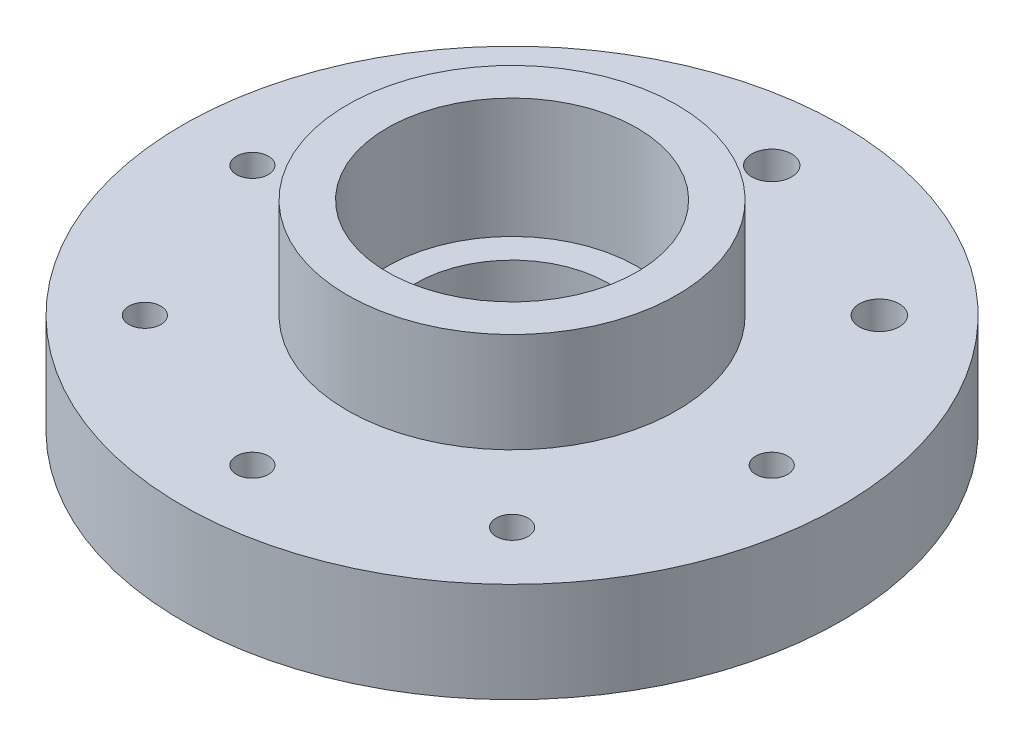
ISO-10303-21;
HEADER;
FILE_DESCRIPTION(('STEP AP214'),'2;1');
FILE_NAME('part.step','',(''),(''),'','','');
FILE_SCHEMA(('AUTOMOTIVE_DESIGN { 1 0 10303 214 1 1 1 1 }'));
ENDSEC;
DATA;
#1=APPLICATION_CONTEXT('core data for automotive mechanical design processes');
#2=APPLICATION_PROTOCOL_DEFINITION('international standard','automotive_design',2000,#1);
#3=PRODUCT_CONTEXT('',#1,'mechanical');
#4=PRODUCT('Part','Part','',(#3));
#5=PRODUCT_RELATED_PRODUCT_CATEGORY('part','',(#4));
#6=PRODUCT_DEFINITION_FORMATION('','',#4);
#7=PRODUCT_DEFINITION_CONTEXT('part definition',#1,'design');
#8=PRODUCT_DEFINITION('design','',#6,#7);
#9=PRODUCT_DEFINITION_SHAPE('','',#8);
#10=(LENGTH_UNIT() NAMED_UNIT(*) SI_UNIT(.MILLI.,.METRE.));
#11=(NAMED_UNIT(*) PLANE_ANGLE_UNIT() SI_UNIT($,.RADIAN.));
#12=(NAMED_UNIT(*) SI_UNIT($,.STERADIAN.) SOLID_ANGLE_UNIT());
#13=UNCERTAINTY_MEASURE_WITH_UNIT(LENGTH_MEASURE(1.E-05),#10,'distance_accuracy_value','');
#14=(GEOMETRIC_REPRESENTATION_CONTEXT(3) GLOBAL_UNCERTAINTY_ASSIGNED_CONTEXT((#13)) GLOBAL_UNIT_ASSIGNED_CONTEXT((#10,
#11,#12)) REPRESENTATION_CONTEXT('',''));
#15=CARTESIAN_POINT('',(0.,0.,0.));
#16=DIRECTION('',(0.,0.,1.));
#17=DIRECTION('',(1.,0.,0.));
#18=AXIS2_PLACEMENT_3D('',#15,#16,#17);
#19=CARTESIAN_POINT('',(0.,0.,0.));
#20=DIRECTION('',(0.,-1.,0.));
#21=DIRECTION('',(0.,0.,-1.));
#22=AXIS2_PLACEMENT_3D('',#19,#20,#21);
#23=CYLINDRICAL_SURFACE('',#22,82.5);
#24=CARTESIAN_POINT('',(0.,25.,0.));
#25=DIRECTION('',(0.,-1.,0.));
#26=DIRECTION('',(0.,0.,-1.));
#27=AXIS2_PLACEMENT_3D('',#24,#25,#26);
#28=CIRCLE('',#27,82.5);
#29=CARTESIAN_POINT('',(0.,25.,-82.5));
#30=VERTEX_POINT('',#29);
#31=EDGE_CURVE('E69',#30,#30,#28,.T.);
#32=ORIENTED_EDGE('',*,*,#31,.T.);
#33=EDGE_LOOP('',(#32));
#34=FACE_BOUND('',#33,.T.);
#35=CARTESIAN_POINT('',(0.,0.,0.));
#36=DIRECTION('',(0.,-1.,0.));
#37=DIRECTION('',(0.,0.,-1.));
#38=AXIS2_PLACEMENT_3D('',#35,#36,#37);
#39=CIRCLE('',#38,82.5);
#40=CARTESIAN_POINT('',(0.,0.,-82.5));
#41=VERTEX_POINT('',#40);
#42=EDGE_CURVE('E10',#41,#41,#39,.T.);
#43=ORIENTED_EDGE('',*,*,#42,.F.);
#44=EDGE_LOOP('',(#43));
#45=FACE_BOUND('',#44,.T.);
#46=ADVANCED_FACE('F30',(#34,#45),#23,.T.);
#47=CARTESIAN_POINT('',(82.5,0.,0.));
#48=DIRECTION('',(0.,-1.,0.));
#49=DIRECTION('',(0.,0.,-1.));
#50=AXIS2_PLACEMENT_3D('',#47,#48,#49);
#51=PLANE('',#50);
#52=CARTESIAN_POINT('',(65.,0.,0.));
#53=DIRECTION('',(0.,-1.,0.));
#54=DIRECTION('',(0.,0.,-1.));
#55=AXIS2_PLACEMENT_3D('',#52,#53,#54);
#56=CIRCLE('',#55,4.00000000000001);
#57=CARTESIAN_POINT('',(65.,0.,-4.00000000000004));
#58=VERTEX_POINT('',#57);
#59=EDGE_CURVE('E50',#58,#58,#56,.T.);
#60=ORIENTED_EDGE('',*,*,#59,.F.);
#61=EDGE_LOOP('',(#60));
#62=FACE_BOUND('',#61,.T.);
#63=CARTESIAN_POINT('',(45.9619407771261,0.,-45.961940777125));
#64=DIRECTION('',(0.,-1.,0.));
#65=DIRECTION('',(0.,0.,-1.));
#66=AXIS2_PLACEMENT_3D('',#63,#64,#65);
#67=CIRCLE('',#66,5.00000000000001);
#68=CARTESIAN_POINT('',(45.9619407771261,0.,-50.961940777125));
#69=VERTEX_POINT('',#68);
#70=EDGE_CURVE('E290',#69,#69,#67,.T.);
#71=ORIENTED_EDGE('',*,*,#70,.F.);
#72=EDGE_LOOP('',(#71));
#73=FACE_BOUND('',#72,.T.);
#74=CARTESIAN_POINT('',(6.93889390390723E-13,0.,-65.));
#75=DIRECTION('',(0.,-1.,0.));
#76=DIRECTION('',(0.,0.,-1.));
#77=AXIS2_PLACEMENT_3D('',#74,#75,#76);
#78=CIRCLE('',#77,5.00000000000001);
#79=CARTESIAN_POINT('',(6.93889390390723E-13,0.,-70.));
#80=VERTEX_POINT('',#79);
#81=EDGE_CURVE('E293',#80,#80,#78,.T.);
#82=ORIENTED_EDGE('',*,*,#81,.F.);
#83=EDGE_LOOP('',(#82));
#84=FACE_BOUND('',#83,.T.);
#85=CARTESIAN_POINT('',(-45.9619407771252,0.,-45.961940777126));
#86=DIRECTION('',(0.,-1.,0.));
#87=DIRECTION('',(0.,0.,-1.));
#88=AXIS2_PLACEMENT_3D('',#85,#86,#87);
#89=CIRCLE('',#88,5.00000000000001);
#90=CARTESIAN_POINT('',(-45.9619407771252,0.,-50.961940777126));
#91=VERTEX_POINT('',#90);
#92=EDGE_CURVE('E298',#91,#91,#89,.T.);
#93=ORIENTED_EDGE('',*,*,#92,.F.);
#94=EDGE_LOOP('',(#93));
#95=FACE_BOUND('',#94,.T.);
#96=CARTESIAN_POINT('',(-65.,0.,0.));
#97=DIRECTION('',(0.,-1.,0.));
#98=DIRECTION('',(0.,0.,-1.));
#99=AXIS2_PLACEMENT_3D('',#96,#97,#98);
#100=CIRCLE('',#99,4.00000000000001);
#101=CARTESIAN_POINT('',(-65.,0.,-4.00000000000001));
#102=VERTEX_POINT('',#101);
#103=EDGE_CURVE('E301',#102,#102,#100,.T.);
#104=ORIENTED_EDGE('',*,*,#103,.F.);
#105=EDGE_LOOP('',(#104));
#106=FACE_BOUND('',#105,.T.);
#107=CARTESIAN_POINT('',(-45.9619407771252,0.,45.961940777126));
#108=DIRECTION('',(0.,-1.,0.));
#109=DIRECTION('',(0.,0.,-1.));
#110=AXIS2_PLACEMENT_3D('',#107,#108,#109);
#111=CIRCLE('',#110,4.00000000000002);
#112=CARTESIAN_POINT('',(-45.9619407771252,0.,41.961940777126));
#113=VERTEX_POINT('',#112);
#114=EDGE_CURVE('E304',#113,#113,#111,.T.);
#115=ORIENTED_EDGE('',*,*,#114,.F.);
#116=EDGE_LOOP('',(#115));
#117=FACE_BOUND('',#116,.T.);
#118=CARTESIAN_POINT('',(7.21644966006352E-13,0.,65.));
#119=DIRECTION('',(0.,-1.,0.));
#120=DIRECTION('',(0.,0.,-1.));
#121=AXIS2_PLACEMENT_3D('',#118,#119,#120);
#122=CIRCLE('',#121,4.00000000000002);
#123=CARTESIAN_POINT('',(7.21644966006352E-13,0.,61.));
#124=VERTEX_POINT('',#123);
#125=EDGE_CURVE('E306',#124,#124,#122,.T.);
#126=ORIENTED_EDGE('',*,*,#125,.F.);
#127=EDGE_LOOP('',(#126));
#128=FACE_BOUND('',#127,.T.);
#129=CARTESIAN_POINT('',(45.9619407771261,0.,45.961940777125));
#130=DIRECTION('',(0.,-1.,0.));
#131=DIRECTION('',(0.,0.,-1.));
#132=AXIS2_PLACEMENT_3D('',#129,#130,#131);
#133=CIRCLE('',#132,4.00000000000002);
#134=CARTESIAN_POINT('',(45.9619407771261,0.,41.961940777125));
#135=VERTEX_POINT('',#134);
#136=EDGE_CURVE('E81',#135,#135,#133,.T.);
#137=ORIENTED_EDGE('',*,*,#136,.F.);
#138=EDGE_LOOP('',(#137));
#139=FACE_BOUND('',#138,.T.);
#140=ORIENTED_EDGE('',*,*,#42,.T.);
#141=EDGE_LOOP('',(#140));
#142=FACE_BOUND('',#141,.T.);
#143=CARTESIAN_POINT('',(0.,0.,0.));
#144=DIRECTION('',(0.,-1.,0.));
#145=DIRECTION('',(0.,0.,-1.));
#146=AXIS2_PLACEMENT_3D('',#143,#144,#145);
#147=CIRCLE('',#146,56.);
#148=CARTESIAN_POINT('',(0.,0.,-56.));
#149=VERTEX_POINT('',#148);
#150=EDGE_CURVE('E37',#149,#149,#147,.T.);
#151=ORIENTED_EDGE('',*,*,#150,.F.);
#152=EDGE_LOOP('',(#151));
#153=FACE_BOUND('',#152,.T.);
#154=ADVANCED_FACE('F105',(#62,#73,#84,#95,#106,#117,#128,#139,#142,#153),#51,.T.);
#155=CARTESIAN_POINT('',(0.,0.,0.));
#156=DIRECTION('',(0.,-1.,0.));
#157=DIRECTION('',(0.,0.,-1.));
#158=AXIS2_PLACEMENT_3D('',#155,#156,#157);
#159=CYLINDRICAL_SURFACE('',#158,56.);
#160=ORIENTED_EDGE('',*,*,#150,.T.);
#161=EDGE_LOOP('',(#160));
#162=FACE_BOUND('',#161,.T.);
#163=CARTESIAN_POINT('',(0.,6.00000000000001,0.));
#164=DIRECTION('',(0.,-1.,0.));
#165=DIRECTION('',(0.,0.,-1.));
#166=AXIS2_PLACEMENT_3D('',#163,#164,#165);
#167=CIRCLE('',#166,56.);
#168=CARTESIAN_POINT('',(0.,6.00000000000001,-56.));
#169=VERTEX_POINT('',#168);
#170=EDGE_CURVE('E42',#169,#169,#167,.T.);
#171=ORIENTED_EDGE('',*,*,#170,.F.);
#172=EDGE_LOOP('',(#171));
#173=FACE_BOUND('',#172,.T.);
#174=ADVANCED_FACE('F103',(#162,#173),#159,.F.);
#175=CARTESIAN_POINT('',(56.,6.00000000000001,0.));
#176=DIRECTION('',(0.,-1.,0.));
#177=DIRECTION('',(0.,0.,-1.));
#178=AXIS2_PLACEMENT_3D('',#175,#176,#177);
#179=PLANE('',#178);
#180=ORIENTED_EDGE('',*,*,#170,.T.);
#181=EDGE_LOOP('',(#180));
#182=FACE_BOUND('',#181,.T.);
#183=CARTESIAN_POINT('',(0.,6.,0.));
#184=DIRECTION('',(0.,-1.,0.));
#185=DIRECTION('',(0.,0.,-1.));
#186=AXIS2_PLACEMENT_3D('',#183,#184,#185);
#187=CIRCLE('',#186,24.);
#188=CARTESIAN_POINT('',(0.,6.,-24.));
#189=VERTEX_POINT('',#188);
#190=EDGE_CURVE('E95',#189,#189,#187,.T.);
#191=ORIENTED_EDGE('',*,*,#190,.F.);
#192=EDGE_LOOP('',(#191));
#193=FACE_BOUND('',#192,.T.);
#194=ADVANCED_FACE('F100',(#182,#193),#179,.T.);
#195=CARTESIAN_POINT('',(0.,0.,0.));
#196=DIRECTION('',(0.,-1.,0.));
#197=DIRECTION('',(0.,0.,-1.));
#198=AXIS2_PLACEMENT_3D('',#195,#196,#197);
#199=CYLINDRICAL_SURFACE('',#198,24.);
#200=ORIENTED_EDGE('',*,*,#190,.T.);
#201=EDGE_LOOP('',(#200));
#202=FACE_BOUND('',#201,.T.);
#203=CARTESIAN_POINT('',(0.,20.,0.));
#204=DIRECTION('',(0.,-1.,0.));
#205=DIRECTION('',(0.,0.,-1.));
#206=AXIS2_PLACEMENT_3D('',#203,#204,#205);
#207=CIRCLE('',#206,24.);
#208=CARTESIAN_POINT('',(0.,20.,-24.));
#209=VERTEX_POINT('',#208);
#210=EDGE_CURVE('E92',#209,#209,#207,.T.);
#211=ORIENTED_EDGE('',*,*,#210,.F.);
#212=EDGE_LOOP('',(#211));
#213=FACE_BOUND('',#212,.T.);
#214=ADVANCED_FACE('F112',(#202,#213),#199,.F.);
#215=CARTESIAN_POINT('',(24.,20.,0.));
#216=DIRECTION('',(0.,1.,0.));
#217=DIRECTION('',(0.,0.,1.));
#218=AXIS2_PLACEMENT_3D('',#215,#216,#217);
#219=PLANE('',#218);
#220=ORIENTED_EDGE('',*,*,#210,.T.);
#221=EDGE_LOOP('',(#220));
#222=FACE_BOUND('',#221,.T.);
#223=CARTESIAN_POINT('',(0.,20.,0.));
#224=DIRECTION('',(0.,-1.,0.));
#225=DIRECTION('',(0.,0.,-1.));
#226=AXIS2_PLACEMENT_3D('',#223,#224,#225);
#227=CIRCLE('',#226,31.2564621680309);
#228=CARTESIAN_POINT('',(0.,20.,-31.2564621680309));
#229=VERTEX_POINT('',#228);
#230=EDGE_CURVE('E89',#229,#229,#227,.T.);
#231=ORIENTED_EDGE('',*,*,#230,.F.);
#232=EDGE_LOOP('',(#231));
#233=FACE_BOUND('',#232,.T.);
#234=ADVANCED_FACE('F233',(#222,#233),#219,.T.);
#235=CARTESIAN_POINT('',(0.,0.,0.));
#236=DIRECTION('',(0.,-1.,0.));
#237=DIRECTION('',(0.,0.,-1.));
#238=AXIS2_PLACEMENT_3D('',#235,#236,#237);
#239=CYLINDRICAL_SURFACE('',#238,31.2564621680309);
#240=ORIENTED_EDGE('',*,*,#230,.T.);
#241=EDGE_LOOP('',(#240));
#242=FACE_BOUND('',#241,.T.);
#243=CARTESIAN_POINT('',(0.,50.,0.));
#244=DIRECTION('',(0.,-1.,0.));
#245=DIRECTION('',(0.,0.,-1.));
#246=AXIS2_PLACEMENT_3D('',#243,#244,#245);
#247=CIRCLE('',#246,31.2564621680309);
#248=CARTESIAN_POINT('',(0.,50.,-31.2564621680309));
#249=VERTEX_POINT('',#248);
#250=EDGE_CURVE('E86',#249,#249,#247,.T.);
#251=ORIENTED_EDGE('',*,*,#250,.F.);
#252=EDGE_LOOP('',(#251));
#253=FACE_BOUND('',#252,.T.);
#254=ADVANCED_FACE('F229',(#242,#253),#239,.F.);
#255=CARTESIAN_POINT('',(31.2564621680309,50.,0.));
#256=DIRECTION('',(0.,1.,0.));
#257=DIRECTION('',(0.,0.,1.));
#258=AXIS2_PLACEMENT_3D('',#255,#256,#257);
#259=PLANE('',#258);
#260=ORIENTED_EDGE('',*,*,#250,.T.);
#261=EDGE_LOOP('',(#260));
#262=FACE_BOUND('',#261,.T.);
#263=CARTESIAN_POINT('',(0.,50.,0.));
#264=DIRECTION('',(0.,-1.,0.));
#265=DIRECTION('',(0.,0.,-1.));
#266=AXIS2_PLACEMENT_3D('',#263,#264,#265);
#267=CIRCLE('',#266,41.2564621680309);
#268=CARTESIAN_POINT('',(0.,50.,-41.2564621680309));
#269=VERTEX_POINT('',#268);
#270=EDGE_CURVE('E78',#269,#269,#267,.T.);
#271=ORIENTED_EDGE('',*,*,#270,.F.);
#272=EDGE_LOOP('',(#271));
#273=FACE_BOUND('',#272,.T.);
#274=ADVANCED_FACE('F225',(#262,#273),#259,.T.);
#275=CARTESIAN_POINT('',(0.,0.,0.));
#276=DIRECTION('',(0.,-1.,0.));
#277=DIRECTION('',(0.,0.,-1.));
#278=AXIS2_PLACEMENT_3D('',#275,#276,#277);
#279=CYLINDRICAL_SURFACE('',#278,41.2564621680309);
#280=ORIENTED_EDGE('',*,*,#270,.T.);
#281=EDGE_LOOP('',(#280));
#282=FACE_BOUND('',#281,.T.);
#283=CARTESIAN_POINT('',(0.,25.,0.));
#284=DIRECTION('',(0.,-1.,0.));
#285=DIRECTION('',(0.,0.,-1.));
#286=AXIS2_PLACEMENT_3D('',#283,#284,#285);
#287=CIRCLE('',#286,41.2564621680309);
#288=CARTESIAN_POINT('',(0.,25.,-41.2564621680309));
#289=VERTEX_POINT('',#288);
#290=EDGE_CURVE('E73',#289,#289,#287,.T.);
#291=ORIENTED_EDGE('',*,*,#290,.F.);
#292=EDGE_LOOP('',(#291));
#293=FACE_BOUND('',#292,.T.);
#294=ADVANCED_FACE('F130',(#282,#293),#279,.T.);
#295=CARTESIAN_POINT('',(82.5,25.,0.));
#296=DIRECTION('',(0.,1.,0.));
#297=DIRECTION('',(0.,0.,1.));
#298=AXIS2_PLACEMENT_3D('',#295,#296,#297);
#299=PLANE('',#298);
#300=CARTESIAN_POINT('',(65.,25.,0.));
#301=DIRECTION('',(0.,1.,0.));
#302=DIRECTION('',(0.,0.,1.));
#303=AXIS2_PLACEMENT_3D('',#300,#301,#302);
#304=CIRCLE('',#303,4.00000000000001);
#305=CARTESIAN_POINT('',(65.,25.,3.99999999999999));
#306=VERTEX_POINT('',#305);
#307=EDGE_CURVE('E33',#306,#306,#304,.T.);
#308=ORIENTED_EDGE('',*,*,#307,.F.);
#309=EDGE_LOOP('',(#308));
#310=FACE_BOUND('',#309,.T.);
#311=CARTESIAN_POINT('',(45.9619407771261,25.,-45.961940777125));
#312=DIRECTION('',(0.,1.,0.));
#313=DIRECTION('',(0.,0.,1.));
#314=AXIS2_PLACEMENT_3D('',#311,#312,#313);
#315=CIRCLE('',#314,5.00000000000001);
#316=CARTESIAN_POINT('',(45.9619407771261,25.,-40.961940777125));
#317=VERTEX_POINT('',#316);
#318=EDGE_CURVE('E64',#317,#317,#315,.T.);
#319=ORIENTED_EDGE('',*,*,#318,.F.);
#320=EDGE_LOOP('',(#319));
#321=FACE_BOUND('',#320,.T.);
#322=CARTESIAN_POINT('',(6.93889390390723E-13,25.,-65.));
#323=DIRECTION('',(0.,1.,0.));
#324=DIRECTION('',(0.,0.,1.));
#325=AXIS2_PLACEMENT_3D('',#322,#323,#324);
#326=CIRCLE('',#325,5.00000000000001);
#327=CARTESIAN_POINT('',(6.93889390390723E-13,25.,-60.));
#328=VERTEX_POINT('',#327);
#329=EDGE_CURVE('E62',#328,#328,#326,.T.);
#330=ORIENTED_EDGE('',*,*,#329,.F.);
#331=EDGE_LOOP('',(#330));
#332=FACE_BOUND('',#331,.T.);
#333=CARTESIAN_POINT('',(-45.9619407771252,25.,-45.961940777126));
#334=DIRECTION('',(0.,1.,0.));
#335=DIRECTION('',(0.,0.,1.));
#336=AXIS2_PLACEMENT_3D('',#333,#334,#335);
#337=CIRCLE('',#336,5.00000000000001);
#338=CARTESIAN_POINT('',(-45.9619407771252,25.,-40.961940777126));
#339=VERTEX_POINT('',#338);
#340=EDGE_CURVE('E59',#339,#339,#337,.T.);
#341=ORIENTED_EDGE('',*,*,#340,.F.);
#342=EDGE_LOOP('',(#341));
#343=FACE_BOUND('',#342,.T.);
#344=CARTESIAN_POINT('',(-65.,25.,0.));
#345=DIRECTION('',(0.,1.,0.));
#346=DIRECTION('',(0.,0.,1.));
#347=AXIS2_PLACEMENT_3D('',#344,#345,#346);
#348=CIRCLE('',#347,4.00000000000001);
#349=CARTESIAN_POINT('',(-65.,25.,4.00000000000001));
#350=VERTEX_POINT('',#349);
#351=EDGE_CURVE('E56',#350,#350,#348,.T.);
#352=ORIENTED_EDGE('',*,*,#351,.F.);
#353=EDGE_LOOP('',(#352));
#354=FACE_BOUND('',#353,.T.);
#355=CARTESIAN_POINT('',(-45.9619407771252,25.,45.961940777126));
#356=DIRECTION('',(0.,1.,0.));
#357=DIRECTION('',(0.,0.,1.));
#358=AXIS2_PLACEMENT_3D('',#355,#356,#357);
#359=CIRCLE('',#358,4.00000000000002);
#360=CARTESIAN_POINT('',(-45.9619407771252,25.,49.961940777126));
#361=VERTEX_POINT('',#360);
#362=EDGE_CURVE('E53',#361,#361,#359,.T.);
#363=ORIENTED_EDGE('',*,*,#362,.F.);
#364=EDGE_LOOP('',(#363));
#365=FACE_BOUND('',#364,.T.);
#366=CARTESIAN_POINT('',(7.21644966006352E-13,25.,65.));
#367=DIRECTION('',(0.,1.,0.));
#368=DIRECTION('',(0.,0.,1.));
#369=AXIS2_PLACEMENT_3D('',#366,#367,#368);
#370=CIRCLE('',#369,4.00000000000002);
#371=CARTESIAN_POINT('',(7.21644966006352E-13,25.,69.));
#372=VERTEX_POINT('',#371);
#373=EDGE_CURVE('E49',#372,#372,#370,.T.);
#374=ORIENTED_EDGE('',*,*,#373,.F.);
#375=EDGE_LOOP('',(#374));
#376=FACE_BOUND('',#375,.T.);
#377=CARTESIAN_POINT('',(45.9619407771261,25.,45.961940777125));
#378=DIRECTION('',(0.,1.,0.));
#379=DIRECTION('',(0.,0.,1.));
#380=AXIS2_PLACEMENT_3D('',#377,#378,#379);
#381=CIRCLE('',#380,4.00000000000002);
#382=CARTESIAN_POINT('',(45.9619407771261,25.,49.961940777125));
#383=VERTEX_POINT('',#382);
#384=EDGE_CURVE('E46',#383,#383,#381,.T.);
#385=ORIENTED_EDGE('',*,*,#384,.F.);
#386=EDGE_LOOP('',(#385));
#387=FACE_BOUND('',#386,.T.);
#388=ORIENTED_EDGE('',*,*,#290,.T.);
#389=EDGE_LOOP('',(#388));
#390=FACE_BOUND('',#389,.T.);
#391=ORIENTED_EDGE('',*,*,#31,.F.);
#392=EDGE_LOOP('',(#391));
#393=FACE_BOUND('',#392,.T.);
#394=ADVANCED_FACE('F135',(#310,#321,#332,#343,#354,#365,#376,#387,#390,#393),#299,.T.);
#395=CARTESIAN_POINT('',(45.9619407771261,50.,45.961940777125));
#396=DIRECTION('',(0.,-1.,0.));
#397=DIRECTION('',(0.,0.,-1.));
#398=AXIS2_PLACEMENT_3D('',#395,#396,#397);
#399=CYLINDRICAL_SURFACE('',#398,4.00000000000002);
#400=ORIENTED_EDGE('',*,*,#384,.T.);
#401=EDGE_LOOP('',(#400));
#402=FACE_BOUND('',#401,.T.);
#403=ORIENTED_EDGE('',*,*,#136,.T.);
#404=EDGE_LOOP('',(#403));
#405=FACE_BOUND('',#404,.T.);
#406=ADVANCED_FACE('F140',(#402,#405),#399,.F.);
#407=CARTESIAN_POINT('',(7.21644966006352E-13,50.,65.));
#408=DIRECTION('',(0.,-1.,0.));
#409=DIRECTION('',(0.,0.,-1.));
#410=AXIS2_PLACEMENT_3D('',#407,#408,#409);
#411=CYLINDRICAL_SURFACE('',#410,4.00000000000002);
#412=ORIENTED_EDGE('',*,*,#373,.T.);
#413=EDGE_LOOP('',(#412));
#414=FACE_BOUND('',#413,.T.);
#415=ORIENTED_EDGE('',*,*,#125,.T.);
#416=EDGE_LOOP('',(#415));
#417=FACE_BOUND('',#416,.T.);
#418=ADVANCED_FACE('F150',(#414,#417),#411,.F.);
#419=CARTESIAN_POINT('',(-45.9619407771252,50.,45.961940777126));
#420=DIRECTION('',(0.,-1.,0.));
#421=DIRECTION('',(0.,0.,-1.));
#422=AXIS2_PLACEMENT_3D('',#419,#420,#421);
#423=CYLINDRICAL_SURFACE('',#422,4.00000000000002);
#424=ORIENTED_EDGE('',*,*,#362,.T.);
#425=EDGE_LOOP('',(#424));
#426=FACE_BOUND('',#425,.T.);
#427=ORIENTED_EDGE('',*,*,#114,.T.);
#428=EDGE_LOOP('',(#427));
#429=FACE_BOUND('',#428,.T.);
#430=ADVANCED_FACE('F160',(#426,#429),#423,.F.);
#431=CARTESIAN_POINT('',(-65.,50.,0.));
#432=DIRECTION('',(0.,-1.,0.));
#433=DIRECTION('',(0.,0.,-1.));
#434=AXIS2_PLACEMENT_3D('',#431,#432,#433);
#435=CYLINDRICAL_SURFACE('',#434,4.00000000000001);
#436=ORIENTED_EDGE('',*,*,#351,.T.);
#437=EDGE_LOOP('',(#436));
#438=FACE_BOUND('',#437,.T.);
#439=ORIENTED_EDGE('',*,*,#103,.T.);
#440=EDGE_LOOP('',(#439));
#441=FACE_BOUND('',#440,.T.);
#442=ADVANCED_FACE('F170',(#438,#441),#435,.F.);
#443=CARTESIAN_POINT('',(-45.9619407771252,50.,-45.961940777126));
#444=DIRECTION('',(0.,-1.,0.));
#445=DIRECTION('',(0.,0.,-1.));
#446=AXIS2_PLACEMENT_3D('',#443,#444,#445);
#447=CYLINDRICAL_SURFACE('',#446,5.00000000000001);
#448=ORIENTED_EDGE('',*,*,#340,.T.);
#449=EDGE_LOOP('',(#448));
#450=FACE_BOUND('',#449,.T.);
#451=ORIENTED_EDGE('',*,*,#92,.T.);
#452=EDGE_LOOP('',(#451));
#453=FACE_BOUND('',#452,.T.);
#454=ADVANCED_FACE('F180',(#450,#453),#447,.F.);
#455=CARTESIAN_POINT('',(6.93889390390723E-13,50.,-65.));
#456=DIRECTION('',(0.,-1.,0.));
#457=DIRECTION('',(0.,0.,-1.));
#458=AXIS2_PLACEMENT_3D('',#455,#456,#457);
#459=CYLINDRICAL_SURFACE('',#458,5.00000000000001);
#460=ORIENTED_EDGE('',*,*,#329,.T.);
#461=EDGE_LOOP('',(#460));
#462=FACE_BOUND('',#461,.T.);
#463=ORIENTED_EDGE('',*,*,#81,.T.);
#464=EDGE_LOOP('',(#463));
#465=FACE_BOUND('',#464,.T.);
#466=ADVANCED_FACE('F190',(#462,#465),#459,.F.);
#467=CARTESIAN_POINT('',(45.9619407771261,50.,-45.961940777125));
#468=DIRECTION('',(0.,-1.,0.));
#469=DIRECTION('',(0.,0.,-1.));
#470=AXIS2_PLACEMENT_3D('',#467,#468,#469);
#471=CYLINDRICAL_SURFACE('',#470,5.00000000000001);
#472=ORIENTED_EDGE('',*,*,#318,.T.);
#473=EDGE_LOOP('',(#472));
#474=FACE_BOUND('',#473,.T.);
#475=ORIENTED_EDGE('',*,*,#70,.T.);
#476=EDGE_LOOP('',(#475));
#477=FACE_BOUND('',#476,.T.);
#478=ADVANCED_FACE('F200',(#474,#477),#471,.F.);
#479=CARTESIAN_POINT('',(65.,50.,0.));
#480=DIRECTION('',(0.,-1.,0.));
#481=DIRECTION('',(0.,0.,-1.));
#482=AXIS2_PLACEMENT_3D('',#479,#480,#481);
#483=CYLINDRICAL_SURFACE('',#482,4.00000000000001);
#484=ORIENTED_EDGE('',*,*,#307,.T.);
#485=EDGE_LOOP('',(#484));
#486=FACE_BOUND('',#485,.T.);
#487=ORIENTED_EDGE('',*,*,#59,.T.);
#488=EDGE_LOOP('',(#487));
#489=FACE_BOUND('',#488,.T.);
#490=ADVANCED_FACE('F210',(#486,#489),#483,.F.);
#491=CLOSED_SHELL('',(#46,#154,#174,#194,#214,#234,#254,#274,#294,#394,#406,#418,#430,#442,#454,
#466,#478,#490));
#492=MANIFOLD_SOLID_BREP('B2',#491);
#493=ADVANCED_BREP_SHAPE_REPRESENTATION('',(#18,#492),#14);
#494=SHAPE_DEFINITION_REPRESENTATION(#9,#493);
ENDSEC;
END-ISO-10303-21;
